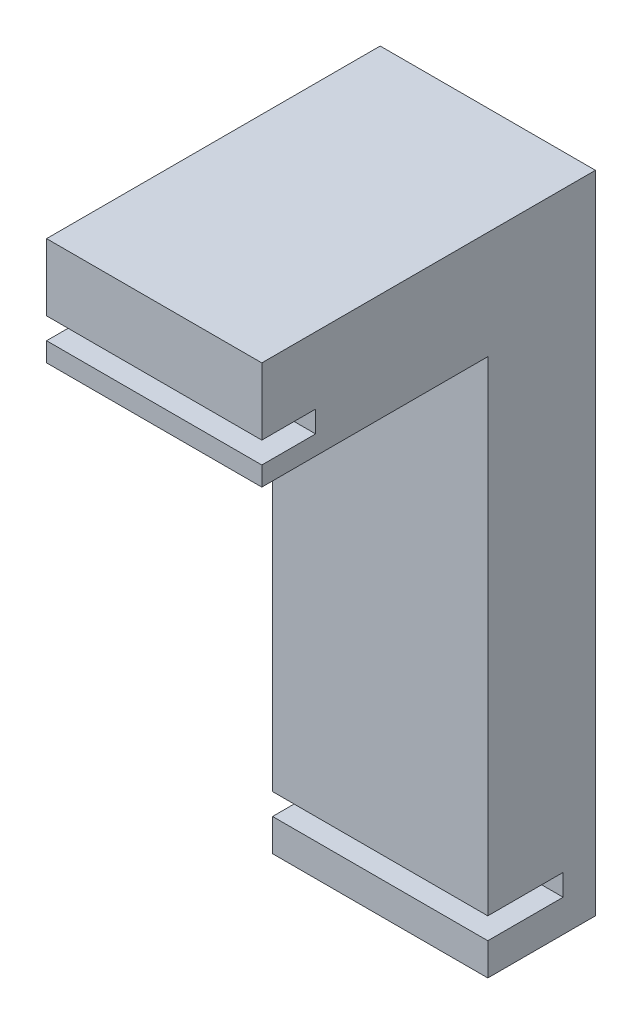
ISO-10303-21;
HEADER;
FILE_DESCRIPTION(('STEP AP214'),'2;1');
FILE_NAME('part.step','',(''),(''),'','','');
FILE_SCHEMA(('AUTOMOTIVE_DESIGN { 1 0 10303 214 1 1 1 1 }'));
ENDSEC;
DATA;
#1=APPLICATION_CONTEXT('core data for automotive mechanical design processes');
#2=APPLICATION_PROTOCOL_DEFINITION('international standard','automotive_design',2000,#1);
#3=PRODUCT_CONTEXT('',#1,'mechanical');
#4=PRODUCT('Part','Part','',(#3));
#5=PRODUCT_RELATED_PRODUCT_CATEGORY('part','',(#4));
#6=PRODUCT_DEFINITION_FORMATION('','',#4);
#7=PRODUCT_DEFINITION_CONTEXT('part definition',#1,'design');
#8=PRODUCT_DEFINITION('design','',#6,#7);
#9=PRODUCT_DEFINITION_SHAPE('','',#8);
#10=(LENGTH_UNIT() NAMED_UNIT(*) SI_UNIT(.MILLI.,.METRE.));
#11=(NAMED_UNIT(*) PLANE_ANGLE_UNIT() SI_UNIT($,.RADIAN.));
#12=(NAMED_UNIT(*) SI_UNIT($,.STERADIAN.) SOLID_ANGLE_UNIT());
#13=UNCERTAINTY_MEASURE_WITH_UNIT(LENGTH_MEASURE(1.E-05),#10,'distance_accuracy_value','');
#14=(GEOMETRIC_REPRESENTATION_CONTEXT(3) GLOBAL_UNCERTAINTY_ASSIGNED_CONTEXT((#13)) GLOBAL_UNIT_ASSIGNED_CONTEXT((#10,
#11,#12)) REPRESENTATION_CONTEXT('',''));
#15=CARTESIAN_POINT('',(0.,0.,0.));
#16=DIRECTION('',(0.,0.,1.));
#17=DIRECTION('',(1.,0.,0.));
#18=AXIS2_PLACEMENT_3D('',#15,#16,#17);
#19=CARTESIAN_POINT('',(-0.001000000000001,0.,10.));
#20=DIRECTION('',(0.,0.,-1.));
#21=DIRECTION('',(-1.,0.,0.));
#22=AXIS2_PLACEMENT_3D('',#19,#20,#21);
#23=PLANE('',#22);
#24=DIRECTION('',(0.,-1.,0.));
#25=VECTOR('',#24,1.);
#26=CARTESIAN_POINT('',(0.,0.,10.));
#27=LINE('',#26,#25);
#28=CARTESIAN_POINT('',(0.,50.,10.));
#29=VERTEX_POINT('',#28);
#30=CARTESIAN_POINT('',(0.,5.,10.));
#31=VERTEX_POINT('',#30);
#32=EDGE_CURVE('E246',#29,#31,#27,.T.);
#33=ORIENTED_EDGE('',*,*,#32,.T.);
#34=DIRECTION('',(1.,0.,0.));
#35=VECTOR('',#34,1.);
#36=CARTESIAN_POINT('',(-0.001000000000001,5.,10.));
#37=LINE('',#36,#35);
#38=CARTESIAN_POINT('',(20.,5.,10.));
#39=VERTEX_POINT('',#38);
#40=EDGE_CURVE('E256',#31,#39,#37,.T.);
#41=ORIENTED_EDGE('',*,*,#40,.T.);
#42=DIRECTION('',(0.,1.,0.));
#43=VECTOR('',#42,1.);
#44=CARTESIAN_POINT('',(20.,0.,10.));
#45=LINE('',#44,#43);
#46=CARTESIAN_POINT('',(20.,50.,10.));
#47=VERTEX_POINT('',#46);
#48=EDGE_CURVE('E161',#39,#47,#45,.T.);
#49=ORIENTED_EDGE('',*,*,#48,.T.);
#50=DIRECTION('',(1.,0.,0.));
#51=VECTOR('',#50,1.);
#52=CARTESIAN_POINT('',(-0.001000000000001,50.,10.));
#53=LINE('',#52,#51);
#54=EDGE_CURVE('E172',#29,#47,#53,.T.);
#55=ORIENTED_EDGE('',*,*,#54,.F.);
#56=EDGE_LOOP('',(#33,#41,#49,#55));
#57=FACE_BOUND('',#56,.T.);
#58=ADVANCED_FACE('F37',(#57),#23,.F.);
#59=CARTESIAN_POINT('',(0.,0.,31.));
#60=DIRECTION('',(0.,0.,-1.));
#61=DIRECTION('',(-1.,0.,0.));
#62=AXIS2_PLACEMENT_3D('',#59,#60,#61);
#63=PLANE('',#62);
#64=DIRECTION('',(0.,-1.,0.));
#65=VECTOR('',#64,1.);
#66=CARTESIAN_POINT('',(0.,0.,31.));
#67=LINE('',#66,#65);
#68=CARTESIAN_POINT('',(0.,60.,31.));
#69=VERTEX_POINT('',#68);
#70=CARTESIAN_POINT('',(0.,53.7836257309942,31.));
#71=VERTEX_POINT('',#70);
#72=EDGE_CURVE('E176',#69,#71,#67,.T.);
#73=ORIENTED_EDGE('',*,*,#72,.T.);
#74=DIRECTION('',(1.,0.,0.));
#75=VECTOR('',#74,1.);
#76=CARTESIAN_POINT('',(-0.001000000000001,53.7836257309942,31.));
#77=LINE('',#76,#75);
#78=CARTESIAN_POINT('',(20.,53.7836257309942,31.));
#79=VERTEX_POINT('',#78);
#80=EDGE_CURVE('E224',#71,#79,#77,.T.);
#81=ORIENTED_EDGE('',*,*,#80,.T.);
#82=DIRECTION('',(0.,1.,0.));
#83=VECTOR('',#82,1.);
#84=CARTESIAN_POINT('',(20.,0.,31.));
#85=LINE('',#84,#83);
#86=CARTESIAN_POINT('',(20.,60.,31.));
#87=VERTEX_POINT('',#86);
#88=EDGE_CURVE('E179',#79,#87,#85,.T.);
#89=ORIENTED_EDGE('',*,*,#88,.T.);
#90=DIRECTION('',(-1.,0.,0.));
#91=VECTOR('',#90,1.);
#92=CARTESIAN_POINT('',(0.,60.,31.));
#93=LINE('',#92,#91);
#94=EDGE_CURVE('E184',#87,#69,#93,.T.);
#95=ORIENTED_EDGE('',*,*,#94,.T.);
#96=EDGE_LOOP('',(#73,#81,#89,#95));
#97=FACE_BOUND('',#96,.T.);
#98=ADVANCED_FACE('F223',(#97),#63,.F.);
#99=CARTESIAN_POINT('',(0.,0.,31.));
#100=DIRECTION('',(1.,0.,0.));
#101=DIRECTION('',(0.,0.,-1.));
#102=AXIS2_PLACEMENT_3D('',#99,#100,#101);
#103=PLANE('',#102);
#104=DIRECTION('',(0.,-1.,0.));
#105=VECTOR('',#104,1.);
#106=CARTESIAN_POINT('',(0.,5.,3.));
#107=LINE('',#106,#105);
#108=CARTESIAN_POINT('',(0.,5.,3.));
#109=VERTEX_POINT('',#108);
#110=CARTESIAN_POINT('',(0.,3.,3.));
#111=VERTEX_POINT('',#110);
#112=EDGE_CURVE('E254',#109,#111,#107,.T.);
#113=ORIENTED_EDGE('',*,*,#112,.F.);
#114=DIRECTION('',(0.,0.,-1.));
#115=VECTOR('',#114,1.);
#116=CARTESIAN_POINT('',(0.,5.,10.));
#117=LINE('',#116,#115);
#118=EDGE_CURVE('E155',#31,#109,#117,.T.);
#119=ORIENTED_EDGE('',*,*,#118,.F.);
#120=ORIENTED_EDGE('',*,*,#32,.F.);
#121=DIRECTION('',(0.,0.,-1.));
#122=VECTOR('',#121,1.);
#123=CARTESIAN_POINT('',(0.,50.,31.));
#124=LINE('',#123,#122);
#125=CARTESIAN_POINT('',(0.,50.,31.));
#126=VERTEX_POINT('',#125);
#127=EDGE_CURVE('E164',#126,#29,#124,.T.);
#128=ORIENTED_EDGE('',*,*,#127,.F.);
#129=CARTESIAN_POINT('',(0.,51.7836257309942,31.));
#130=VERTEX_POINT('',#129);
#131=EDGE_CURVE('E180',#130,#126,#67,.T.);
#132=ORIENTED_EDGE('',*,*,#131,.F.);
#133=DIRECTION('',(0.,0.,1.));
#134=VECTOR('',#133,1.);
#135=CARTESIAN_POINT('',(0.,51.7836257309942,31.));
#136=LINE('',#135,#134);
#137=CARTESIAN_POINT('',(0.,51.7836257309942,26.));
#138=VERTEX_POINT('',#137);
#139=EDGE_CURVE('E60',#138,#130,#136,.T.);
#140=ORIENTED_EDGE('',*,*,#139,.F.);
#141=DIRECTION('',(0.,-1.,0.));
#142=VECTOR('',#141,1.);
#143=CARTESIAN_POINT('',(0.,53.7836257309942,26.));
#144=LINE('',#143,#142);
#145=CARTESIAN_POINT('',(0.,53.7836257309942,26.));
#146=VERTEX_POINT('',#145);
#147=EDGE_CURVE('E255',#146,#138,#144,.T.);
#148=ORIENTED_EDGE('',*,*,#147,.F.);
#149=DIRECTION('',(0.,0.,-1.));
#150=VECTOR('',#149,1.);
#151=CARTESIAN_POINT('',(0.,53.7836257309942,31.));
#152=LINE('',#151,#150);
#153=EDGE_CURVE('E220',#71,#146,#152,.T.);
#154=ORIENTED_EDGE('',*,*,#153,.F.);
#155=ORIENTED_EDGE('',*,*,#72,.F.);
#156=DIRECTION('',(0.,0.,-1.));
#157=VECTOR('',#156,1.);
#158=CARTESIAN_POINT('',(0.,60.,31.));
#159=LINE('',#158,#157);
#160=CARTESIAN_POINT('',(0.,60.,0.));
#161=VERTEX_POINT('',#160);
#162=EDGE_CURVE('E186',#69,#161,#159,.T.);
#163=ORIENTED_EDGE('',*,*,#162,.T.);
#164=DIRECTION('',(0.,-1.,0.));
#165=VECTOR('',#164,1.);
#166=CARTESIAN_POINT('',(0.,0.,0.));
#167=LINE('',#166,#165);
#168=CARTESIAN_POINT('',(0.,0.,0.));
#169=VERTEX_POINT('',#168);
#170=EDGE_CURVE('E171',#161,#169,#167,.T.);
#171=ORIENTED_EDGE('',*,*,#170,.T.);
#172=DIRECTION('',(0.,0.,-1.));
#173=VECTOR('',#172,1.);
#174=CARTESIAN_POINT('',(0.,0.,31.));
#175=LINE('',#174,#173);
#176=CARTESIAN_POINT('',(0.,0.,10.));
#177=VERTEX_POINT('',#176);
#178=EDGE_CURVE('E11',#177,#169,#175,.T.);
#179=ORIENTED_EDGE('',*,*,#178,.F.);
#180=CARTESIAN_POINT('',(0.,3.,10.));
#181=VERTEX_POINT('',#180);
#182=EDGE_CURVE('E245',#181,#177,#27,.T.);
#183=ORIENTED_EDGE('',*,*,#182,.F.);
#184=DIRECTION('',(0.,0.,1.));
#185=VECTOR('',#184,1.);
#186=CARTESIAN_POINT('',(0.,3.,10.));
#187=LINE('',#186,#185);
#188=EDGE_CURVE('E52',#111,#181,#187,.T.);
#189=ORIENTED_EDGE('',*,*,#188,.F.);
#190=EDGE_LOOP('',(#113,#119,#120,#128,#132,#140,#148,#154,#155,#163,#171,#179,#183,#189));
#191=FACE_BOUND('',#190,.T.);
#192=ADVANCED_FACE('F39',(#191),#103,.F.);
#193=CARTESIAN_POINT('',(0.,0.,31.));
#194=DIRECTION('',(0.,1.,0.));
#195=DIRECTION('',(0.,0.,1.));
#196=AXIS2_PLACEMENT_3D('',#193,#194,#195);
#197=PLANE('',#196);
#198=DIRECTION('',(0.,0.,-1.));
#199=VECTOR('',#198,1.);
#200=CARTESIAN_POINT('',(20.,0.,31.));
#201=LINE('',#200,#199);
#202=CARTESIAN_POINT('',(20.,0.,10.));
#203=VERTEX_POINT('',#202);
#204=CARTESIAN_POINT('',(20.,0.,0.));
#205=VERTEX_POINT('',#204);
#206=EDGE_CURVE('E45',#203,#205,#201,.T.);
#207=ORIENTED_EDGE('',*,*,#206,.F.);
#208=DIRECTION('',(1.,0.,0.));
#209=VECTOR('',#208,1.);
#210=CARTESIAN_POINT('',(-0.001000000000001,0.,10.));
#211=LINE('',#210,#209);
#212=EDGE_CURVE('E159',#177,#203,#211,.T.);
#213=ORIENTED_EDGE('',*,*,#212,.F.);
#214=ORIENTED_EDGE('',*,*,#178,.T.);
#215=DIRECTION('',(1.,0.,0.));
#216=VECTOR('',#215,1.);
#217=CARTESIAN_POINT('',(0.,0.,0.));
#218=LINE('',#217,#216);
#219=EDGE_CURVE('E189',#169,#205,#218,.T.);
#220=ORIENTED_EDGE('',*,*,#219,.T.);
#221=EDGE_LOOP('',(#207,#213,#214,#220));
#222=FACE_BOUND('',#221,.T.);
#223=ADVANCED_FACE('F204',(#222),#197,.F.);
#224=CARTESIAN_POINT('',(20.,0.,31.));
#225=DIRECTION('',(-1.,0.,0.));
#226=DIRECTION('',(0.,0.,1.));
#227=AXIS2_PLACEMENT_3D('',#224,#225,#226);
#228=PLANE('',#227);
#229=ORIENTED_EDGE('',*,*,#48,.F.);
#230=DIRECTION('',(0.,0.,1.));
#231=VECTOR('',#230,1.);
#232=CARTESIAN_POINT('',(20.,5.,10.));
#233=LINE('',#232,#231);
#234=CARTESIAN_POINT('',(20.,5.,3.));
#235=VERTEX_POINT('',#234);
#236=EDGE_CURVE('E144',#235,#39,#233,.T.);
#237=ORIENTED_EDGE('',*,*,#236,.F.);
#238=DIRECTION('',(0.,1.,0.));
#239=VECTOR('',#238,1.);
#240=CARTESIAN_POINT('',(20.,5.,3.));
#241=LINE('',#240,#239);
#242=CARTESIAN_POINT('',(20.,3.,3.));
#243=VERTEX_POINT('',#242);
#244=EDGE_CURVE('E154',#243,#235,#241,.T.);
#245=ORIENTED_EDGE('',*,*,#244,.F.);
#246=DIRECTION('',(0.,0.,-1.));
#247=VECTOR('',#246,1.);
#248=CARTESIAN_POINT('',(20.,3.,10.));
#249=LINE('',#248,#247);
#250=CARTESIAN_POINT('',(20.,3.,10.));
#251=VERTEX_POINT('',#250);
#252=EDGE_CURVE('E138',#251,#243,#249,.T.);
#253=ORIENTED_EDGE('',*,*,#252,.F.);
#254=EDGE_CURVE('E150',#203,#251,#45,.T.);
#255=ORIENTED_EDGE('',*,*,#254,.F.);
#256=ORIENTED_EDGE('',*,*,#206,.T.);
#257=DIRECTION('',(0.,1.,0.));
#258=VECTOR('',#257,1.);
#259=CARTESIAN_POINT('',(20.,0.,0.));
#260=LINE('',#259,#258);
#261=CARTESIAN_POINT('',(20.,60.,0.));
#262=VERTEX_POINT('',#261);
#263=EDGE_CURVE('E192',#205,#262,#260,.T.);
#264=ORIENTED_EDGE('',*,*,#263,.T.);
#265=DIRECTION('',(0.,0.,-1.));
#266=VECTOR('',#265,1.);
#267=CARTESIAN_POINT('',(20.,60.,31.));
#268=LINE('',#267,#266);
#269=EDGE_CURVE('E198',#87,#262,#268,.T.);
#270=ORIENTED_EDGE('',*,*,#269,.F.);
#271=ORIENTED_EDGE('',*,*,#88,.F.);
#272=DIRECTION('',(0.,0.,1.));
#273=VECTOR('',#272,1.);
#274=CARTESIAN_POINT('',(20.,53.7836257309942,31.));
#275=LINE('',#274,#273);
#276=CARTESIAN_POINT('',(20.,53.7836257309942,26.));
#277=VERTEX_POINT('',#276);
#278=EDGE_CURVE('E228',#277,#79,#275,.T.);
#279=ORIENTED_EDGE('',*,*,#278,.F.);
#280=DIRECTION('',(0.,1.,0.));
#281=VECTOR('',#280,1.);
#282=CARTESIAN_POINT('',(20.,53.7836257309942,26.));
#283=LINE('',#282,#281);
#284=CARTESIAN_POINT('',(20.,51.7836257309942,26.));
#285=VERTEX_POINT('',#284);
#286=EDGE_CURVE('E231',#285,#277,#283,.T.);
#287=ORIENTED_EDGE('',*,*,#286,.F.);
#288=DIRECTION('',(0.,0.,-1.));
#289=VECTOR('',#288,1.);
#290=CARTESIAN_POINT('',(20.,51.7836257309942,31.));
#291=LINE('',#290,#289);
#292=CARTESIAN_POINT('',(20.,51.7836257309942,31.));
#293=VERTEX_POINT('',#292);
#294=EDGE_CURVE('E237',#293,#285,#291,.T.);
#295=ORIENTED_EDGE('',*,*,#294,.F.);
#296=CARTESIAN_POINT('',(20.,50.,31.));
#297=VERTEX_POINT('',#296);
#298=EDGE_CURVE('E181',#297,#293,#85,.T.);
#299=ORIENTED_EDGE('',*,*,#298,.F.);
#300=DIRECTION('',(0.,0.,1.));
#301=VECTOR('',#300,1.);
#302=CARTESIAN_POINT('',(20.,50.,31.));
#303=LINE('',#302,#301);
#304=EDGE_CURVE('E160',#47,#297,#303,.T.);
#305=ORIENTED_EDGE('',*,*,#304,.F.);
#306=EDGE_LOOP('',(#229,#237,#245,#253,#255,#256,#264,#270,#271,#279,#287,#295,#299,#305));
#307=FACE_BOUND('',#306,.T.);
#308=ADVANCED_FACE('F149',(#307),#228,.F.);
#309=CARTESIAN_POINT('',(0.,60.,31.));
#310=DIRECTION('',(0.,-1.,0.));
#311=DIRECTION('',(0.,0.,-1.));
#312=AXIS2_PLACEMENT_3D('',#309,#310,#311);
#313=PLANE('',#312);
#314=DIRECTION('',(-1.,0.,0.));
#315=VECTOR('',#314,1.);
#316=CARTESIAN_POINT('',(0.,60.,0.));
#317=LINE('',#316,#315);
#318=EDGE_CURVE('E194',#262,#161,#317,.T.);
#319=ORIENTED_EDGE('',*,*,#318,.T.);
#320=ORIENTED_EDGE('',*,*,#162,.F.);
#321=ORIENTED_EDGE('',*,*,#94,.F.);
#322=ORIENTED_EDGE('',*,*,#269,.T.);
#323=EDGE_LOOP('',(#319,#320,#321,#322));
#324=FACE_BOUND('',#323,.T.);
#325=ADVANCED_FACE('F212',(#324),#313,.F.);
#326=ORIENTED_EDGE('',*,*,#298,.T.);
#327=DIRECTION('',(1.,0.,0.));
#328=VECTOR('',#327,1.);
#329=CARTESIAN_POINT('',(-0.001000000000001,51.7836257309942,31.));
#330=LINE('',#329,#328);
#331=EDGE_CURVE('E233',#130,#293,#330,.T.);
#332=ORIENTED_EDGE('',*,*,#331,.F.);
#333=ORIENTED_EDGE('',*,*,#131,.T.);
#334=DIRECTION('',(1.,0.,0.));
#335=VECTOR('',#334,1.);
#336=CARTESIAN_POINT('',(-0.001000000000001,50.,31.));
#337=LINE('',#336,#335);
#338=EDGE_CURVE('E168',#126,#297,#337,.T.);
#339=ORIENTED_EDGE('',*,*,#338,.T.);
#340=EDGE_LOOP('',(#326,#332,#333,#339));
#341=FACE_BOUND('',#340,.T.);
#342=ADVANCED_FACE('F269',(#341),#63,.F.);
#343=CARTESIAN_POINT('',(0.,0.,0.));
#344=DIRECTION('',(0.,0.,-1.));
#345=DIRECTION('',(-1.,0.,0.));
#346=AXIS2_PLACEMENT_3D('',#343,#344,#345);
#347=PLANE('',#346);
#348=ORIENTED_EDGE('',*,*,#170,.F.);
#349=ORIENTED_EDGE('',*,*,#318,.F.);
#350=ORIENTED_EDGE('',*,*,#263,.F.);
#351=ORIENTED_EDGE('',*,*,#219,.F.);
#352=EDGE_LOOP('',(#348,#349,#350,#351));
#353=FACE_BOUND('',#352,.T.);
#354=ADVANCED_FACE('F209',(#353),#347,.T.);
#355=CARTESIAN_POINT('',(-0.001000000000001,50.,31.));
#356=DIRECTION('',(0.,1.,0.));
#357=DIRECTION('',(0.,0.,1.));
#358=AXIS2_PLACEMENT_3D('',#355,#356,#357);
#359=PLANE('',#358);
#360=ORIENTED_EDGE('',*,*,#127,.T.);
#361=ORIENTED_EDGE('',*,*,#54,.T.);
#362=ORIENTED_EDGE('',*,*,#304,.T.);
#363=ORIENTED_EDGE('',*,*,#338,.F.);
#364=EDGE_LOOP('',(#360,#361,#362,#363));
#365=FACE_BOUND('',#364,.T.);
#366=ADVANCED_FACE('F274',(#365),#359,.F.);
#367=ORIENTED_EDGE('',*,*,#254,.T.);
#368=DIRECTION('',(1.,0.,0.));
#369=VECTOR('',#368,1.);
#370=CARTESIAN_POINT('',(-0.001000000000001,3.,10.));
#371=LINE('',#370,#369);
#372=EDGE_CURVE('E135',#181,#251,#371,.T.);
#373=ORIENTED_EDGE('',*,*,#372,.F.);
#374=ORIENTED_EDGE('',*,*,#182,.T.);
#375=ORIENTED_EDGE('',*,*,#212,.T.);
#376=EDGE_LOOP('',(#367,#373,#374,#375));
#377=FACE_BOUND('',#376,.T.);
#378=ADVANCED_FACE('F157',(#377),#23,.F.);
#379=CARTESIAN_POINT('',(-0.001000000000001,53.7836257309942,31.));
#380=DIRECTION('',(0.,1.,0.));
#381=DIRECTION('',(0.,0.,1.));
#382=AXIS2_PLACEMENT_3D('',#379,#380,#381);
#383=PLANE('',#382);
#384=ORIENTED_EDGE('',*,*,#153,.T.);
#385=DIRECTION('',(1.,0.,0.));
#386=VECTOR('',#385,1.);
#387=CARTESIAN_POINT('',(-0.001000000000001,53.7836257309942,26.));
#388=LINE('',#387,#386);
#389=EDGE_CURVE('E242',#146,#277,#388,.T.);
#390=ORIENTED_EDGE('',*,*,#389,.T.);
#391=ORIENTED_EDGE('',*,*,#278,.T.);
#392=ORIENTED_EDGE('',*,*,#80,.F.);
#393=EDGE_LOOP('',(#384,#390,#391,#392));
#394=FACE_BOUND('',#393,.T.);
#395=ADVANCED_FACE('F293',(#394),#383,.F.);
#396=CARTESIAN_POINT('',(-0.001000000000001,53.7836257309942,26.));
#397=DIRECTION('',(0.,0.,-1.));
#398=DIRECTION('',(-1.,0.,0.));
#399=AXIS2_PLACEMENT_3D('',#396,#397,#398);
#400=PLANE('',#399);
#401=ORIENTED_EDGE('',*,*,#147,.T.);
#402=DIRECTION('',(1.,0.,0.));
#403=VECTOR('',#402,1.);
#404=CARTESIAN_POINT('',(-0.001000000000001,51.7836257309942,26.));
#405=LINE('',#404,#403);
#406=EDGE_CURVE('E235',#138,#285,#405,.T.);
#407=ORIENTED_EDGE('',*,*,#406,.T.);
#408=ORIENTED_EDGE('',*,*,#286,.T.);
#409=ORIENTED_EDGE('',*,*,#389,.F.);
#410=EDGE_LOOP('',(#401,#407,#408,#409));
#411=FACE_BOUND('',#410,.T.);
#412=ADVANCED_FACE('F298',(#411),#400,.F.);
#413=CARTESIAN_POINT('',(-0.001000000000001,51.7836257309942,31.));
#414=DIRECTION('',(0.,-1.,0.));
#415=DIRECTION('',(0.,0.,-1.));
#416=AXIS2_PLACEMENT_3D('',#413,#414,#415);
#417=PLANE('',#416);
#418=ORIENTED_EDGE('',*,*,#139,.T.);
#419=ORIENTED_EDGE('',*,*,#331,.T.);
#420=ORIENTED_EDGE('',*,*,#294,.T.);
#421=ORIENTED_EDGE('',*,*,#406,.F.);
#422=EDGE_LOOP('',(#418,#419,#420,#421));
#423=FACE_BOUND('',#422,.T.);
#424=ADVANCED_FACE('F265',(#423),#417,.F.);
#425=CARTESIAN_POINT('',(-0.001000000000001,5.,10.));
#426=DIRECTION('',(0.,1.,0.));
#427=DIRECTION('',(0.,0.,1.));
#428=AXIS2_PLACEMENT_3D('',#425,#426,#427);
#429=PLANE('',#428);
#430=ORIENTED_EDGE('',*,*,#118,.T.);
#431=DIRECTION('',(1.,0.,0.));
#432=VECTOR('',#431,1.);
#433=CARTESIAN_POINT('',(-0.001000000000001,5.,3.));
#434=LINE('',#433,#432);
#435=EDGE_CURVE('E260',#109,#235,#434,.T.);
#436=ORIENTED_EDGE('',*,*,#435,.T.);
#437=ORIENTED_EDGE('',*,*,#236,.T.);
#438=ORIENTED_EDGE('',*,*,#40,.F.);
#439=EDGE_LOOP('',(#430,#436,#437,#438));
#440=FACE_BOUND('',#439,.T.);
#441=ADVANCED_FACE('F284',(#440),#429,.F.);
#442=CARTESIAN_POINT('',(-0.001000000000001,5.,3.));
#443=DIRECTION('',(0.,0.,-1.));
#444=DIRECTION('',(0.,1.,0.));
#445=AXIS2_PLACEMENT_3D('',#442,#443,#444);
#446=PLANE('',#445);
#447=ORIENTED_EDGE('',*,*,#112,.T.);
#448=DIRECTION('',(1.,0.,0.));
#449=VECTOR('',#448,1.);
#450=CARTESIAN_POINT('',(-0.001000000000001,3.,3.));
#451=LINE('',#450,#449);
#452=EDGE_CURVE('E143',#111,#243,#451,.T.);
#453=ORIENTED_EDGE('',*,*,#452,.T.);
#454=ORIENTED_EDGE('',*,*,#244,.T.);
#455=ORIENTED_EDGE('',*,*,#435,.F.);
#456=EDGE_LOOP('',(#447,#453,#454,#455));
#457=FACE_BOUND('',#456,.T.);
#458=ADVANCED_FACE('F283',(#457),#446,.F.);
#459=CARTESIAN_POINT('',(-0.001000000000001,3.,10.));
#460=DIRECTION('',(0.,-1.,0.));
#461=DIRECTION('',(0.,0.,-1.));
#462=AXIS2_PLACEMENT_3D('',#459,#460,#461);
#463=PLANE('',#462);
#464=ORIENTED_EDGE('',*,*,#188,.T.);
#465=ORIENTED_EDGE('',*,*,#372,.T.);
#466=ORIENTED_EDGE('',*,*,#252,.T.);
#467=ORIENTED_EDGE('',*,*,#452,.F.);
#468=EDGE_LOOP('',(#464,#465,#466,#467));
#469=FACE_BOUND('',#468,.T.);
#470=ADVANCED_FACE('F137',(#469),#463,.F.);
#471=CLOSED_SHELL('',(#58,#98,#192,#223,#308,#325,#342,#354,#366,#378,#395,#412,#424,#441,#458,#470));
#472=MANIFOLD_SOLID_BREP('B2',#471);
#473=ADVANCED_BREP_SHAPE_REPRESENTATION('',(#18,#472),#14);
#474=SHAPE_DEFINITION_REPRESENTATION(#9,#473);
ENDSEC;
END-ISO-10303-21;
